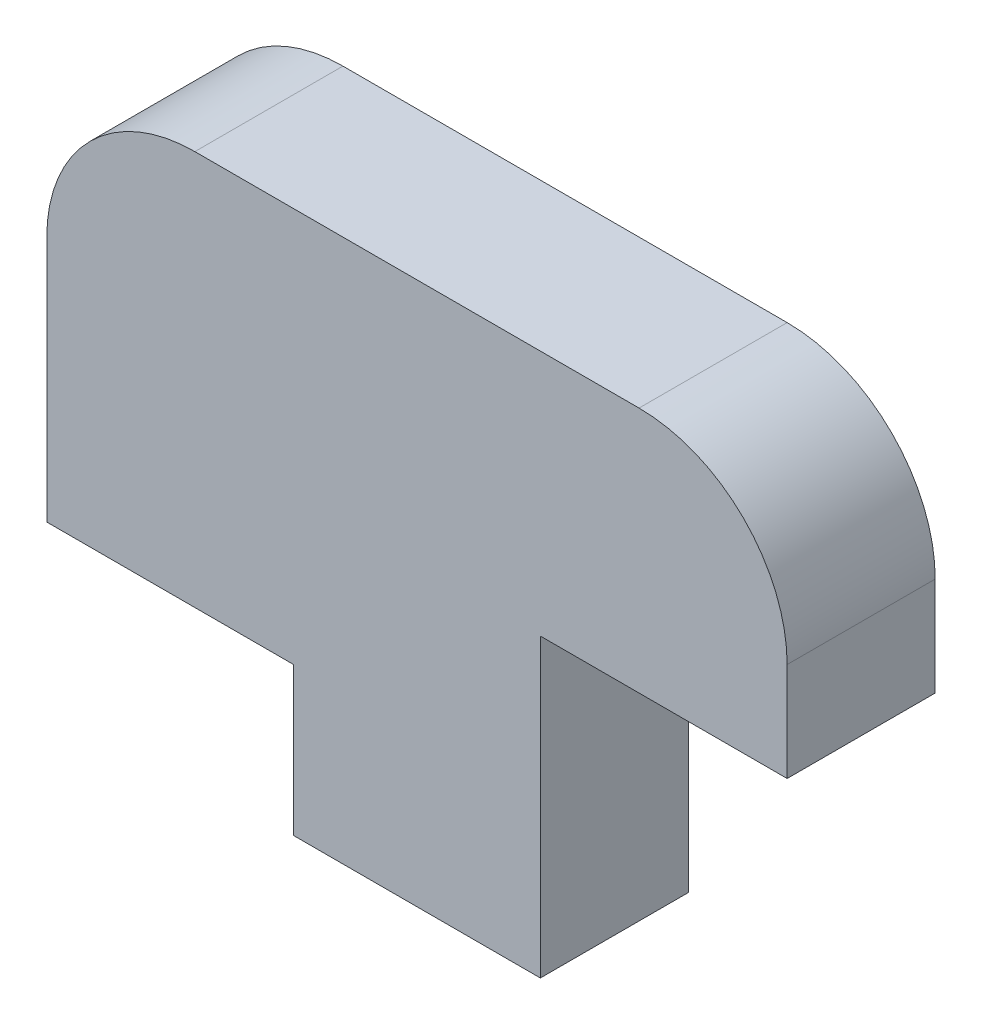
ISO-10303-21;
HEADER;
FILE_DESCRIPTION(('STEP AP214'),'2;1');
FILE_NAME('part.step','',(''),(''),'','','');
FILE_SCHEMA(('AUTOMOTIVE_DESIGN { 1 0 10303 214 1 1 1 1 }'));
ENDSEC;
DATA;
#1=APPLICATION_CONTEXT('core data for automotive mechanical design processes');
#2=APPLICATION_PROTOCOL_DEFINITION('international standard','automotive_design',2000,#1);
#3=PRODUCT_CONTEXT('',#1,'mechanical');
#4=PRODUCT('Part','Part','',(#3));
#5=PRODUCT_RELATED_PRODUCT_CATEGORY('part','',(#4));
#6=PRODUCT_DEFINITION_FORMATION('','',#4);
#7=PRODUCT_DEFINITION_CONTEXT('part definition',#1,'design');
#8=PRODUCT_DEFINITION('design','',#6,#7);
#9=PRODUCT_DEFINITION_SHAPE('','',#8);
#10=(LENGTH_UNIT() NAMED_UNIT(*) SI_UNIT(.MILLI.,.METRE.));
#11=(NAMED_UNIT(*) PLANE_ANGLE_UNIT() SI_UNIT($,.RADIAN.));
#12=(NAMED_UNIT(*) SI_UNIT($,.STERADIAN.) SOLID_ANGLE_UNIT());
#13=UNCERTAINTY_MEASURE_WITH_UNIT(LENGTH_MEASURE(1.E-05),#10,'distance_accuracy_value','');
#14=(GEOMETRIC_REPRESENTATION_CONTEXT(3) GLOBAL_UNCERTAINTY_ASSIGNED_CONTEXT((#13)) GLOBAL_UNIT_ASSIGNED_CONTEXT((#10,
#11,#12)) REPRESENTATION_CONTEXT('',''));
#15=CARTESIAN_POINT('',(0.,0.,0.));
#16=DIRECTION('',(0.,0.,1.));
#17=DIRECTION('',(1.,0.,0.));
#18=AXIS2_PLACEMENT_3D('',#15,#16,#17);
#19=CARTESIAN_POINT('',(-5.00000000000012,3.,3.00000000000001));
#20=DIRECTION('',(0.,1.,0.));
#21=DIRECTION('',(-1.,0.,0.));
#22=AXIS2_PLACEMENT_3D('',#19,#20,#21);
#23=PLANE('',#22);
#24=DIRECTION('',(1.,0.,0.));
#25=VECTOR('',#24,1.);
#26=CARTESIAN_POINT('',(-4.99999999999989,3.,0.));
#27=LINE('',#26,#25);
#28=CARTESIAN_POINT('',(-10.,3.,0.));
#29=VERTEX_POINT('',#28);
#30=CARTESIAN_POINT('',(-4.99999999999989,3.,0.));
#31=VERTEX_POINT('',#30);
#32=EDGE_CURVE('E138',#29,#31,#27,.T.);
#33=ORIENTED_EDGE('',*,*,#32,.T.);
#34=DIRECTION('',(0.,0.,-1.));
#35=VECTOR('',#34,1.);
#36=CARTESIAN_POINT('',(-5.00000000000012,3.,3.00000000000001));
#37=LINE('',#36,#35);
#38=CARTESIAN_POINT('',(-5.00000000000012,3.,3.00000000000001));
#39=VERTEX_POINT('',#38);
#40=EDGE_CURVE('E11',#39,#31,#37,.T.);
#41=ORIENTED_EDGE('',*,*,#40,.F.);
#42=DIRECTION('',(1.,0.,0.));
#43=VECTOR('',#42,1.);
#44=CARTESIAN_POINT('',(-5.00000000000012,3.,3.00000000000001));
#45=LINE('',#44,#43);
#46=CARTESIAN_POINT('',(-10.,3.,3.00000000000002));
#47=VERTEX_POINT('',#46);
#48=EDGE_CURVE('E156',#47,#39,#45,.T.);
#49=ORIENTED_EDGE('',*,*,#48,.F.);
#50=DIRECTION('',(0.,0.,-1.));
#51=VECTOR('',#50,1.);
#52=CARTESIAN_POINT('',(-10.,3.,3.00000000000002));
#53=LINE('',#52,#51);
#54=EDGE_CURVE('E134',#47,#29,#53,.T.);
#55=ORIENTED_EDGE('',*,*,#54,.T.);
#56=EDGE_LOOP('',(#33,#41,#49,#55));
#57=FACE_BOUND('',#56,.T.);
#58=ADVANCED_FACE('F30',(#57),#23,.F.);
#59=CARTESIAN_POINT('',(-5.00000000000012,3.,3.00000000000001));
#60=DIRECTION('',(1.,0.,0.));
#61=DIRECTION('',(0.,0.,-1.));
#62=AXIS2_PLACEMENT_3D('',#59,#60,#61);
#63=PLANE('',#62);
#64=DIRECTION('',(0.,-1.,0.));
#65=VECTOR('',#64,1.);
#66=CARTESIAN_POINT('',(-4.99999999999989,3.,0.));
#67=LINE('',#66,#65);
#68=CARTESIAN_POINT('',(-4.99999999999989,0.,0.));
#69=VERTEX_POINT('',#68);
#70=EDGE_CURVE('E141',#31,#69,#67,.T.);
#71=ORIENTED_EDGE('',*,*,#70,.T.);
#72=DIRECTION('',(0.,0.,-1.));
#73=VECTOR('',#72,1.);
#74=CARTESIAN_POINT('',(-5.00000000000012,0.,3.00000000000001));
#75=LINE('',#74,#73);
#76=CARTESIAN_POINT('',(-5.00000000000012,0.,3.00000000000001));
#77=VERTEX_POINT('',#76);
#78=EDGE_CURVE('E38',#77,#69,#75,.T.);
#79=ORIENTED_EDGE('',*,*,#78,.F.);
#80=DIRECTION('',(0.,-1.,0.));
#81=VECTOR('',#80,1.);
#82=CARTESIAN_POINT('',(-5.00000000000012,3.,3.00000000000001));
#83=LINE('',#82,#81);
#84=EDGE_CURVE('E95',#39,#77,#83,.T.);
#85=ORIENTED_EDGE('',*,*,#84,.F.);
#86=ORIENTED_EDGE('',*,*,#40,.T.);
#87=EDGE_LOOP('',(#71,#79,#85,#86));
#88=FACE_BOUND('',#87,.T.);
#89=ADVANCED_FACE('F205',(#88),#63,.F.);
#90=CARTESIAN_POINT('',(-5.00000000000012,0.,3.00000000000001));
#91=DIRECTION('',(0.,1.,0.));
#92=DIRECTION('',(0.,0.,1.));
#93=AXIS2_PLACEMENT_3D('',#90,#91,#92);
#94=PLANE('',#93);
#95=DIRECTION('',(1.,0.,0.));
#96=VECTOR('',#95,1.);
#97=CARTESIAN_POINT('',(-4.99999999999989,0.,0.));
#98=LINE('',#97,#96);
#99=CARTESIAN_POINT('',(0.,0.,0.));
#100=VERTEX_POINT('',#99);
#101=EDGE_CURVE('E143',#69,#100,#98,.T.);
#102=ORIENTED_EDGE('',*,*,#101,.T.);
#103=DIRECTION('',(0.,0.,-1.));
#104=VECTOR('',#103,1.);
#105=CARTESIAN_POINT('',(0.,0.,3.00000000000001));
#106=LINE('',#105,#104);
#107=CARTESIAN_POINT('',(0.,0.,3.00000000000001));
#108=VERTEX_POINT('',#107);
#109=EDGE_CURVE('E169',#108,#100,#106,.T.);
#110=ORIENTED_EDGE('',*,*,#109,.F.);
#111=DIRECTION('',(1.,0.,0.));
#112=VECTOR('',#111,1.);
#113=CARTESIAN_POINT('',(-5.00000000000012,0.,3.00000000000001));
#114=LINE('',#113,#112);
#115=EDGE_CURVE('E177',#77,#108,#114,.T.);
#116=ORIENTED_EDGE('',*,*,#115,.F.);
#117=ORIENTED_EDGE('',*,*,#78,.T.);
#118=EDGE_LOOP('',(#102,#110,#116,#117));
#119=FACE_BOUND('',#118,.T.);
#120=ADVANCED_FACE('F175',(#119),#94,.F.);
#121=CARTESIAN_POINT('',(0.,0.,3.00000000000001));
#122=DIRECTION('',(-1.,0.,0.));
#123=DIRECTION('',(0.,0.,1.));
#124=AXIS2_PLACEMENT_3D('',#121,#122,#123);
#125=PLANE('',#124);
#126=DIRECTION('',(0.,1.,0.));
#127=VECTOR('',#126,1.);
#128=CARTESIAN_POINT('',(0.,0.,0.));
#129=LINE('',#128,#127);
#130=CARTESIAN_POINT('',(0.,6.00000000000001,0.));
#131=VERTEX_POINT('',#130);
#132=EDGE_CURVE('E145',#100,#131,#129,.T.);
#133=ORIENTED_EDGE('',*,*,#132,.T.);
#134=DIRECTION('',(0.,0.,-1.));
#135=VECTOR('',#134,1.);
#136=CARTESIAN_POINT('',(0.,6.00000000000001,3.00000000000001));
#137=LINE('',#136,#135);
#138=CARTESIAN_POINT('',(0.,6.00000000000001,3.00000000000001));
#139=VERTEX_POINT('',#138);
#140=EDGE_CURVE('E166',#139,#131,#137,.T.);
#141=ORIENTED_EDGE('',*,*,#140,.F.);
#142=DIRECTION('',(0.,1.,0.));
#143=VECTOR('',#142,1.);
#144=CARTESIAN_POINT('',(0.,0.,3.00000000000001));
#145=LINE('',#144,#143);
#146=EDGE_CURVE('E195',#108,#139,#145,.T.);
#147=ORIENTED_EDGE('',*,*,#146,.F.);
#148=ORIENTED_EDGE('',*,*,#109,.T.);
#149=EDGE_LOOP('',(#133,#141,#147,#148));
#150=FACE_BOUND('',#149,.T.);
#151=ADVANCED_FACE('F186',(#150),#125,.F.);
#152=CARTESIAN_POINT('',(4.99999999999989,6.,3.00000000000001));
#153=DIRECTION('',(0.,1.,0.));
#154=DIRECTION('',(-1.,0.,0.));
#155=AXIS2_PLACEMENT_3D('',#152,#153,#154);
#156=PLANE('',#155);
#157=DIRECTION('',(1.,0.,0.));
#158=VECTOR('',#157,1.);
#159=CARTESIAN_POINT('',(4.99999999999989,6.,0.));
#160=LINE('',#159,#158);
#161=CARTESIAN_POINT('',(4.99999999999989,6.,0.));
#162=VERTEX_POINT('',#161);
#163=EDGE_CURVE('E147',#131,#162,#160,.T.);
#164=ORIENTED_EDGE('',*,*,#163,.T.);
#165=DIRECTION('',(0.,0.,-1.));
#166=VECTOR('',#165,1.);
#167=CARTESIAN_POINT('',(4.99999999999989,6.,3.00000000000001));
#168=LINE('',#167,#166);
#169=CARTESIAN_POINT('',(4.99999999999989,6.,3.00000000000001));
#170=VERTEX_POINT('',#169);
#171=EDGE_CURVE('E163',#170,#162,#168,.T.);
#172=ORIENTED_EDGE('',*,*,#171,.F.);
#173=DIRECTION('',(1.,0.,0.));
#174=VECTOR('',#173,1.);
#175=CARTESIAN_POINT('',(4.99999999999989,6.,3.00000000000001));
#176=LINE('',#175,#174);
#177=EDGE_CURVE('E192',#139,#170,#176,.T.);
#178=ORIENTED_EDGE('',*,*,#177,.F.);
#179=ORIENTED_EDGE('',*,*,#140,.T.);
#180=EDGE_LOOP('',(#164,#172,#178,#179));
#181=FACE_BOUND('',#180,.T.);
#182=ADVANCED_FACE('F190',(#181),#156,.F.);
#183=CARTESIAN_POINT('',(4.99999999999989,6.,3.00000000000001));
#184=DIRECTION('',(-1.,0.,0.));
#185=DIRECTION('',(0.,0.,1.));
#186=AXIS2_PLACEMENT_3D('',#183,#184,#185);
#187=PLANE('',#186);
#188=DIRECTION('',(0.,1.,0.));
#189=VECTOR('',#188,1.);
#190=CARTESIAN_POINT('',(4.99999999999989,6.,0.));
#191=LINE('',#190,#189);
#192=CARTESIAN_POINT('',(4.99999999999989,7.99999999999998,0.));
#193=VERTEX_POINT('',#192);
#194=EDGE_CURVE('E149',#162,#193,#191,.T.);
#195=ORIENTED_EDGE('',*,*,#194,.T.);
#196=DIRECTION('',(0.,0.,-1.));
#197=VECTOR('',#196,1.);
#198=CARTESIAN_POINT('',(4.99999999999989,7.99999999999998,3.00000000000001));
#199=LINE('',#198,#197);
#200=CARTESIAN_POINT('',(4.99999999999989,7.99999999999998,3.00000000000001));
#201=VERTEX_POINT('',#200);
#202=EDGE_CURVE('E160',#201,#193,#199,.T.);
#203=ORIENTED_EDGE('',*,*,#202,.F.);
#204=DIRECTION('',(0.,1.,0.));
#205=VECTOR('',#204,1.);
#206=CARTESIAN_POINT('',(4.99999999999989,6.,3.00000000000001));
#207=LINE('',#206,#205);
#208=EDGE_CURVE('E194',#170,#201,#207,.T.);
#209=ORIENTED_EDGE('',*,*,#208,.F.);
#210=ORIENTED_EDGE('',*,*,#171,.T.);
#211=EDGE_LOOP('',(#195,#203,#209,#210));
#212=FACE_BOUND('',#211,.T.);
#213=ADVANCED_FACE('F217',(#212),#187,.F.);
#214=CARTESIAN_POINT('',(2.,7.99999999999998,3.00000000000001));
#215=DIRECTION('',(0.,0.,-1.));
#216=DIRECTION('',(-1.,0.,0.));
#217=AXIS2_PLACEMENT_3D('',#214,#215,#216);
#218=CYLINDRICAL_SURFACE('',#217,3.00000000000002);
#219=CARTESIAN_POINT('',(2.,7.99999999999998,0.));
#220=DIRECTION('',(0.,0.,1.));
#221=DIRECTION('',(1.,0.,0.));
#222=AXIS2_PLACEMENT_3D('',#219,#220,#221);
#223=CIRCLE('',#222,3.00000000000002);
#224=CARTESIAN_POINT('',(2.,11.,0.));
#225=VERTEX_POINT('',#224);
#226=EDGE_CURVE('E151',#193,#225,#223,.T.);
#227=ORIENTED_EDGE('',*,*,#226,.T.);
#228=DIRECTION('',(0.,0.,-1.));
#229=VECTOR('',#228,1.);
#230=CARTESIAN_POINT('',(2.,11.,3.00000000000001));
#231=LINE('',#230,#229);
#232=CARTESIAN_POINT('',(2.,11.,3.00000000000001));
#233=VERTEX_POINT('',#232);
#234=EDGE_CURVE('E129',#233,#225,#231,.T.);
#235=ORIENTED_EDGE('',*,*,#234,.F.);
#236=CARTESIAN_POINT('',(2.,7.99999999999998,3.00000000000001));
#237=DIRECTION('',(0.,0.,1.));
#238=DIRECTION('',(1.,0.,0.));
#239=AXIS2_PLACEMENT_3D('',#236,#237,#238);
#240=CIRCLE('',#239,3.00000000000002);
#241=EDGE_CURVE('E120',#201,#233,#240,.T.);
#242=ORIENTED_EDGE('',*,*,#241,.F.);
#243=ORIENTED_EDGE('',*,*,#202,.T.);
#244=EDGE_LOOP('',(#227,#235,#242,#243));
#245=FACE_BOUND('',#244,.T.);
#246=ADVANCED_FACE('F220',(#245),#218,.T.);
#247=CARTESIAN_POINT('',(-7.00000000000012,11.,3.00000000000002));
#248=DIRECTION('',(0.,-1.,0.));
#249=DIRECTION('',(1.,0.,0.));
#250=AXIS2_PLACEMENT_3D('',#247,#248,#249);
#251=PLANE('',#250);
#252=DIRECTION('',(-1.,0.,0.));
#253=VECTOR('',#252,1.);
#254=CARTESIAN_POINT('',(-6.9999999999999,11.,0.));
#255=LINE('',#254,#253);
#256=CARTESIAN_POINT('',(-6.9999999999999,11.,0.));
#257=VERTEX_POINT('',#256);
#258=EDGE_CURVE('E128',#225,#257,#255,.T.);
#259=ORIENTED_EDGE('',*,*,#258,.T.);
#260=DIRECTION('',(0.,0.,-1.));
#261=VECTOR('',#260,1.);
#262=CARTESIAN_POINT('',(-7.00000000000012,11.,3.00000000000002));
#263=LINE('',#262,#261);
#264=CARTESIAN_POINT('',(-7.00000000000012,11.,3.00000000000002));
#265=VERTEX_POINT('',#264);
#266=EDGE_CURVE('E125',#265,#257,#263,.T.);
#267=ORIENTED_EDGE('',*,*,#266,.F.);
#268=DIRECTION('',(-1.,0.,0.));
#269=VECTOR('',#268,1.);
#270=CARTESIAN_POINT('',(-7.00000000000012,11.,3.00000000000002));
#271=LINE('',#270,#269);
#272=EDGE_CURVE('E114',#233,#265,#271,.T.);
#273=ORIENTED_EDGE('',*,*,#272,.F.);
#274=ORIENTED_EDGE('',*,*,#234,.T.);
#275=EDGE_LOOP('',(#259,#267,#273,#274));
#276=FACE_BOUND('',#275,.T.);
#277=ADVANCED_FACE('F126',(#276),#251,.F.);
#278=CARTESIAN_POINT('',(-7.00000000000012,8.,3.00000000000002));
#279=DIRECTION('',(0.,0.,-1.));
#280=DIRECTION('',(-1.,0.,0.));
#281=AXIS2_PLACEMENT_3D('',#278,#279,#280);
#282=CYLINDRICAL_SURFACE('',#281,3.);
#283=CARTESIAN_POINT('',(-6.9999999999999,8.,0.));
#284=DIRECTION('',(0.,0.,1.));
#285=DIRECTION('',(1.,0.,0.));
#286=AXIS2_PLACEMENT_3D('',#283,#284,#285);
#287=CIRCLE('',#286,3.);
#288=CARTESIAN_POINT('',(-10.,8.,0.));
#289=VERTEX_POINT('',#288);
#290=EDGE_CURVE('E81',#257,#289,#287,.T.);
#291=ORIENTED_EDGE('',*,*,#290,.T.);
#292=DIRECTION('',(0.,0.,-1.));
#293=VECTOR('',#292,1.);
#294=CARTESIAN_POINT('',(-10.,8.,3.00000000000002));
#295=LINE('',#294,#293);
#296=CARTESIAN_POINT('',(-10.,8.,3.00000000000002));
#297=VERTEX_POINT('',#296);
#298=EDGE_CURVE('E130',#297,#289,#295,.T.);
#299=ORIENTED_EDGE('',*,*,#298,.F.);
#300=CARTESIAN_POINT('',(-7.00000000000012,8.,3.00000000000002));
#301=DIRECTION('',(0.,0.,1.));
#302=DIRECTION('',(1.,0.,0.));
#303=AXIS2_PLACEMENT_3D('',#300,#301,#302);
#304=CIRCLE('',#303,3.);
#305=EDGE_CURVE('E118',#265,#297,#304,.T.);
#306=ORIENTED_EDGE('',*,*,#305,.F.);
#307=ORIENTED_EDGE('',*,*,#266,.T.);
#308=EDGE_LOOP('',(#291,#299,#306,#307));
#309=FACE_BOUND('',#308,.T.);
#310=ADVANCED_FACE('F132',(#309),#282,.T.);
#311=CARTESIAN_POINT('',(-10.,3.,3.00000000000002));
#312=DIRECTION('',(1.,0.,0.));
#313=DIRECTION('',(0.,0.,-1.));
#314=AXIS2_PLACEMENT_3D('',#311,#312,#313);
#315=PLANE('',#314);
#316=DIRECTION('',(0.,-1.,0.));
#317=VECTOR('',#316,1.);
#318=CARTESIAN_POINT('',(-10.,3.,0.));
#319=LINE('',#318,#317);
#320=EDGE_CURVE('E87',#289,#29,#319,.T.);
#321=ORIENTED_EDGE('',*,*,#320,.T.);
#322=ORIENTED_EDGE('',*,*,#54,.F.);
#323=DIRECTION('',(0.,-1.,0.));
#324=VECTOR('',#323,1.);
#325=CARTESIAN_POINT('',(-10.,3.,3.00000000000002));
#326=LINE('',#325,#324);
#327=EDGE_CURVE('E46',#297,#47,#326,.T.);
#328=ORIENTED_EDGE('',*,*,#327,.F.);
#329=ORIENTED_EDGE('',*,*,#298,.T.);
#330=EDGE_LOOP('',(#321,#322,#328,#329));
#331=FACE_BOUND('',#330,.T.);
#332=ADVANCED_FACE('F229',(#331),#315,.F.);
#333=CARTESIAN_POINT('',(-7.00000000000012,8.,3.00000000000002));
#334=DIRECTION('',(0.,0.,1.));
#335=DIRECTION('',(1.,0.,0.));
#336=AXIS2_PLACEMENT_3D('',#333,#334,#335);
#337=PLANE('',#336);
#338=ORIENTED_EDGE('',*,*,#48,.T.);
#339=ORIENTED_EDGE('',*,*,#84,.T.);
#340=ORIENTED_EDGE('',*,*,#115,.T.);
#341=ORIENTED_EDGE('',*,*,#146,.T.);
#342=ORIENTED_EDGE('',*,*,#177,.T.);
#343=ORIENTED_EDGE('',*,*,#208,.T.);
#344=ORIENTED_EDGE('',*,*,#241,.T.);
#345=ORIENTED_EDGE('',*,*,#272,.T.);
#346=ORIENTED_EDGE('',*,*,#305,.T.);
#347=ORIENTED_EDGE('',*,*,#327,.T.);
#348=EDGE_LOOP('',(#338,#339,#340,#341,#342,#343,#344,#345,#346,#347));
#349=FACE_BOUND('',#348,.T.);
#350=ADVANCED_FACE('F116',(#349),#337,.T.);
#351=CARTESIAN_POINT('',(-6.9999999999999,8.,0.));
#352=DIRECTION('',(0.,0.,1.));
#353=DIRECTION('',(1.,0.,0.));
#354=AXIS2_PLACEMENT_3D('',#351,#352,#353);
#355=PLANE('',#354);
#356=ORIENTED_EDGE('',*,*,#32,.F.);
#357=ORIENTED_EDGE('',*,*,#320,.F.);
#358=ORIENTED_EDGE('',*,*,#290,.F.);
#359=ORIENTED_EDGE('',*,*,#258,.F.);
#360=ORIENTED_EDGE('',*,*,#226,.F.);
#361=ORIENTED_EDGE('',*,*,#194,.F.);
#362=ORIENTED_EDGE('',*,*,#163,.F.);
#363=ORIENTED_EDGE('',*,*,#132,.F.);
#364=ORIENTED_EDGE('',*,*,#101,.F.);
#365=ORIENTED_EDGE('',*,*,#70,.F.);
#366=EDGE_LOOP('',(#356,#357,#358,#359,#360,#361,#362,#363,#364,#365));
#367=FACE_BOUND('',#366,.T.);
#368=ADVANCED_FACE('F181',(#367),#355,.F.);
#369=CLOSED_SHELL('',(#58,#89,#120,#151,#182,#213,#246,#277,#310,#332,#350,#368));
#370=MANIFOLD_SOLID_BREP('B2',#369);
#371=ADVANCED_BREP_SHAPE_REPRESENTATION('',(#18,#370),#14);
#372=SHAPE_DEFINITION_REPRESENTATION(#9,#371);
ENDSEC;
END-ISO-10303-21;
